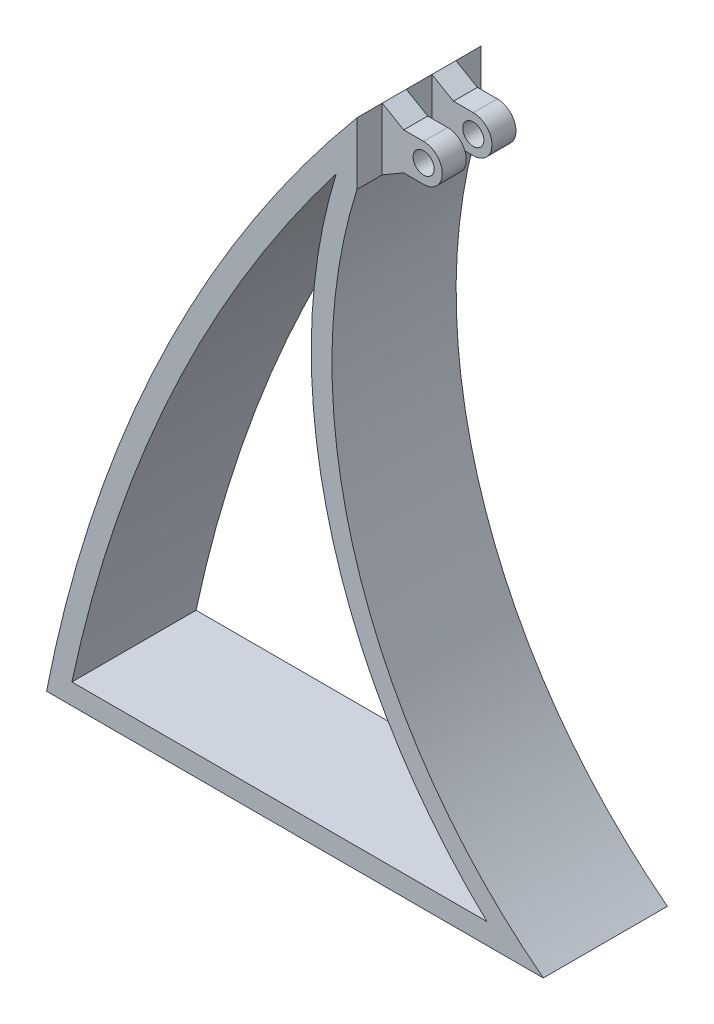
ISO-10303-21;
HEADER;
FILE_DESCRIPTION(('STEP AP214'),'2;1');
FILE_NAME('part.step','',(''),(''),'','','');
FILE_SCHEMA(('AUTOMOTIVE_DESIGN { 1 0 10303 214 1 1 1 1 }'));
ENDSEC;
DATA;
#1=APPLICATION_CONTEXT('core data for automotive mechanical design processes');
#2=APPLICATION_PROTOCOL_DEFINITION('international standard','automotive_design',2000,#1);
#3=PRODUCT_CONTEXT('',#1,'mechanical');
#4=PRODUCT('Part','Part','',(#3));
#5=PRODUCT_RELATED_PRODUCT_CATEGORY('part','',(#4));
#6=PRODUCT_DEFINITION_FORMATION('','',#4);
#7=PRODUCT_DEFINITION_CONTEXT('part definition',#1,'design');
#8=PRODUCT_DEFINITION('design','',#6,#7);
#9=PRODUCT_DEFINITION_SHAPE('','',#8);
#10=(LENGTH_UNIT() NAMED_UNIT(*) SI_UNIT(.MILLI.,.METRE.));
#11=(NAMED_UNIT(*) PLANE_ANGLE_UNIT() SI_UNIT($,.RADIAN.));
#12=(NAMED_UNIT(*) SI_UNIT($,.STERADIAN.) SOLID_ANGLE_UNIT());
#13=UNCERTAINTY_MEASURE_WITH_UNIT(LENGTH_MEASURE(1.E-05),#10,'distance_accuracy_value','');
#14=(GEOMETRIC_REPRESENTATION_CONTEXT(3) GLOBAL_UNCERTAINTY_ASSIGNED_CONTEXT((#13)) GLOBAL_UNIT_ASSIGNED_CONTEXT((#10,
#11,#12)) REPRESENTATION_CONTEXT('',''));
#15=CARTESIAN_POINT('',(0.,0.,0.));
#16=DIRECTION('',(0.,0.,1.));
#17=DIRECTION('',(1.,0.,0.));
#18=AXIS2_PLACEMENT_3D('',#15,#16,#17);
#19=CARTESIAN_POINT('',(15.,0.,15.));
#20=DIRECTION('',(1.,0.,0.));
#21=DIRECTION('',(0.,1.,0.));
#22=AXIS2_PLACEMENT_3D('',#19,#20,#21);
#23=PLANE('',#22);
#24=DIRECTION('',(0.,0.,-1.));
#25=VECTOR('',#24,1.);
#26=CARTESIAN_POINT('',(15.,157.5,15.));
#27=LINE('',#26,#25);
#28=CARTESIAN_POINT('',(15.,157.5,-8.9));
#29=VERTEX_POINT('',#28);
#30=CARTESIAN_POINT('',(15.,157.5,-15.));
#31=VERTEX_POINT('',#30);
#32=EDGE_CURVE('E403',#29,#31,#27,.T.);
#33=ORIENTED_EDGE('',*,*,#32,.F.);
#34=DIRECTION('',(0.,-1.,0.));
#35=VECTOR('',#34,1.);
#36=CARTESIAN_POINT('',(15.,157.5,-8.9));
#37=LINE('',#36,#35);
#38=CARTESIAN_POINT('',(15.,142.5,-8.9));
#39=VERTEX_POINT('',#38);
#40=EDGE_CURVE('E58',#29,#39,#37,.T.);
#41=ORIENTED_EDGE('',*,*,#40,.T.);
#42=DIRECTION('',(0.,0.,-1.));
#43=VECTOR('',#42,1.);
#44=CARTESIAN_POINT('',(15.,142.5,15.));
#45=LINE('',#44,#43);
#46=CARTESIAN_POINT('',(15.,142.5,-15.));
#47=VERTEX_POINT('',#46);
#48=EDGE_CURVE('E51',#39,#47,#45,.T.);
#49=ORIENTED_EDGE('',*,*,#48,.T.);
#50=DIRECTION('',(0.,-1.,0.));
#51=VECTOR('',#50,1.);
#52=CARTESIAN_POINT('',(15.,0.,-15.));
#53=LINE('',#52,#51);
#54=EDGE_CURVE('E388',#31,#47,#53,.T.);
#55=ORIENTED_EDGE('',*,*,#54,.F.);
#56=EDGE_LOOP('',(#33,#41,#49,#55));
#57=FACE_BOUND('',#56,.T.);
#58=ADVANCED_FACE('F41',(#57),#23,.T.);
#59=CARTESIAN_POINT('',(15.,142.5,15.));
#60=VERTEX_POINT('',#59);
#61=CARTESIAN_POINT('',(15.,142.5,8.9));
#62=VERTEX_POINT('',#61);
#63=EDGE_CURVE('E11',#60,#62,#45,.T.);
#64=ORIENTED_EDGE('',*,*,#63,.T.);
#65=DIRECTION('',(0.,-1.,0.));
#66=VECTOR('',#65,1.);
#67=CARTESIAN_POINT('',(15.,157.5,8.9));
#68=LINE('',#67,#66);
#69=CARTESIAN_POINT('',(15.,157.5,8.9));
#70=VERTEX_POINT('',#69);
#71=EDGE_CURVE('E269',#70,#62,#68,.T.);
#72=ORIENTED_EDGE('',*,*,#71,.F.);
#73=CARTESIAN_POINT('',(15.,157.5,15.));
#74=VERTEX_POINT('',#73);
#75=EDGE_CURVE('E404',#74,#70,#27,.T.);
#76=ORIENTED_EDGE('',*,*,#75,.F.);
#77=DIRECTION('',(0.,-1.,0.));
#78=VECTOR('',#77,1.);
#79=CARTESIAN_POINT('',(15.,0.,15.));
#80=LINE('',#79,#78);
#81=EDGE_CURVE('E373',#74,#60,#80,.T.);
#82=ORIENTED_EDGE('',*,*,#81,.T.);
#83=EDGE_LOOP('',(#64,#72,#76,#82));
#84=FACE_BOUND('',#83,.T.);
#85=ADVANCED_FACE('F435',(#84),#23,.T.);
#86=CARTESIAN_POINT('',(138.944289130681,103.285038672847,15.));
#87=DIRECTION('',(0.,0.,-1.));
#88=DIRECTION('',(-1.,0.,0.));
#89=AXIS2_PLACEMENT_3D('',#86,#87,#88);
#90=CYLINDRICAL_SURFACE('',#89,130.);
#91=CARTESIAN_POINT('',(138.944289130681,103.285038672847,-15.));
#92=DIRECTION('',(0.,0.,1.));
#93=DIRECTION('',(1.,0.,0.));
#94=AXIS2_PLACEMENT_3D('',#91,#92,#93);
#95=CIRCLE('',#94,130.);
#96=CARTESIAN_POINT('',(60.,0.,-15.));
#97=VERTEX_POINT('',#96);
#98=EDGE_CURVE('E359',#47,#97,#95,.T.);
#99=ORIENTED_EDGE('',*,*,#98,.F.);
#100=ORIENTED_EDGE('',*,*,#48,.F.);
#101=DIRECTION('',(0.,0.,1.));
#102=VECTOR('',#101,1.);
#103=CARTESIAN_POINT('',(15.,142.5,-8.9));
#104=LINE('',#103,#102);
#105=CARTESIAN_POINT('',(15.,142.5,-3.1));
#106=VERTEX_POINT('',#105);
#107=EDGE_CURVE('E247',#39,#106,#104,.T.);
#108=ORIENTED_EDGE('',*,*,#107,.T.);
#109=CARTESIAN_POINT('',(15.,142.5,3.1));
#110=VERTEX_POINT('',#109);
#111=EDGE_CURVE('E50',#110,#106,#45,.T.);
#112=ORIENTED_EDGE('',*,*,#111,.F.);
#113=DIRECTION('',(0.,0.,-1.));
#114=VECTOR('',#113,1.);
#115=CARTESIAN_POINT('',(15.,142.5,8.9));
#116=LINE('',#115,#114);
#117=EDGE_CURVE('E317',#62,#110,#116,.T.);
#118=ORIENTED_EDGE('',*,*,#117,.F.);
#119=ORIENTED_EDGE('',*,*,#63,.F.);
#120=CARTESIAN_POINT('',(138.944289130681,103.285038672847,15.));
#121=DIRECTION('',(0.,0.,1.));
#122=DIRECTION('',(1.,0.,0.));
#123=AXIS2_PLACEMENT_3D('',#120,#121,#122);
#124=CIRCLE('',#123,130.);
#125=CARTESIAN_POINT('',(60.,0.,15.));
#126=VERTEX_POINT('',#125);
#127=EDGE_CURVE('E369',#60,#126,#124,.T.);
#128=ORIENTED_EDGE('',*,*,#127,.T.);
#129=DIRECTION('',(0.,0.,-1.));
#130=VECTOR('',#129,1.);
#131=CARTESIAN_POINT('',(60.,0.,15.));
#132=LINE('',#131,#130);
#133=EDGE_CURVE('E384',#126,#97,#132,.T.);
#134=ORIENTED_EDGE('',*,*,#133,.T.);
#135=EDGE_LOOP('',(#99,#100,#108,#112,#118,#119,#128,#134));
#136=FACE_BOUND('',#135,.T.);
#137=ADVANCED_FACE('F43',(#136),#90,.F.);
#138=DIRECTION('',(0.,-1.,0.));
#139=VECTOR('',#138,1.);
#140=CARTESIAN_POINT('',(15.,157.5,-3.1));
#141=LINE('',#140,#139);
#142=CARTESIAN_POINT('',(15.,157.5,-3.1));
#143=VERTEX_POINT('',#142);
#144=EDGE_CURVE('E203',#143,#106,#141,.T.);
#145=ORIENTED_EDGE('',*,*,#144,.F.);
#146=CARTESIAN_POINT('',(15.,157.5,3.1));
#147=VERTEX_POINT('',#146);
#148=EDGE_CURVE('E407',#147,#143,#27,.T.);
#149=ORIENTED_EDGE('',*,*,#148,.F.);
#150=DIRECTION('',(0.,-1.,0.));
#151=VECTOR('',#150,1.);
#152=CARTESIAN_POINT('',(15.,157.5,3.1));
#153=LINE('',#152,#151);
#154=EDGE_CURVE('E288',#147,#110,#153,.T.);
#155=ORIENTED_EDGE('',*,*,#154,.T.);
#156=ORIENTED_EDGE('',*,*,#111,.T.);
#157=EDGE_LOOP('',(#145,#149,#155,#156));
#158=FACE_BOUND('',#157,.T.);
#159=ADVANCED_FACE('F453',(#158),#23,.T.);
#160=CARTESIAN_POINT('',(283.531345233212,-66.9792120158153,15.));
#161=DIRECTION('',(0.,0.,-1.));
#162=DIRECTION('',(-1.,0.,0.));
#163=AXIS2_PLACEMENT_3D('',#160,#161,#162);
#164=CYLINDRICAL_SURFACE('',#163,350.);
#165=CARTESIAN_POINT('',(283.531345233212,-66.9792120158153,-15.));
#166=DIRECTION('',(0.,0.,1.));
#167=DIRECTION('',(1.,0.,0.));
#168=AXIS2_PLACEMENT_3D('',#165,#166,#167);
#169=CIRCLE('',#168,350.);
#170=CARTESIAN_POINT('',(-60.,0.,-15.));
#171=VERTEX_POINT('',#170);
#172=EDGE_CURVE('E392',#31,#171,#169,.T.);
#173=ORIENTED_EDGE('',*,*,#172,.T.);
#174=DIRECTION('',(0.,0.,-1.));
#175=VECTOR('',#174,1.);
#176=CARTESIAN_POINT('',(-60.,0.,15.));
#177=LINE('',#176,#175);
#178=CARTESIAN_POINT('',(-60.,0.,15.));
#179=VERTEX_POINT('',#178);
#180=EDGE_CURVE('E400',#179,#171,#177,.T.);
#181=ORIENTED_EDGE('',*,*,#180,.F.);
#182=CARTESIAN_POINT('',(283.531345233212,-66.9792120158153,15.));
#183=DIRECTION('',(0.,0.,1.));
#184=DIRECTION('',(1.,0.,0.));
#185=AXIS2_PLACEMENT_3D('',#182,#183,#184);
#186=CIRCLE('',#185,350.);
#187=EDGE_CURVE('E378',#74,#179,#186,.T.);
#188=ORIENTED_EDGE('',*,*,#187,.F.);
#189=ORIENTED_EDGE('',*,*,#75,.T.);
#190=DIRECTION('',(0.,0.,-1.));
#191=VECTOR('',#190,1.);
#192=CARTESIAN_POINT('',(15.,157.5,8.9));
#193=LINE('',#192,#191);
#194=EDGE_CURVE('E320',#70,#147,#193,.T.);
#195=ORIENTED_EDGE('',*,*,#194,.T.);
#196=ORIENTED_EDGE('',*,*,#148,.T.);
#197=DIRECTION('',(0.,0.,1.));
#198=VECTOR('',#197,1.);
#199=CARTESIAN_POINT('',(15.,157.5,-8.9));
#200=LINE('',#199,#198);
#201=EDGE_CURVE('E223',#29,#143,#200,.T.);
#202=ORIENTED_EDGE('',*,*,#201,.F.);
#203=ORIENTED_EDGE('',*,*,#32,.T.);
#204=EDGE_LOOP('',(#173,#181,#188,#189,#195,#196,#202,#203));
#205=FACE_BOUND('',#204,.T.);
#206=ADVANCED_FACE('F416',(#205),#164,.T.);
#207=CARTESIAN_POINT('',(0.,0.,15.));
#208=DIRECTION('',(0.,1.,0.));
#209=DIRECTION('',(0.,0.,1.));
#210=AXIS2_PLACEMENT_3D('',#207,#208,#209);
#211=PLANE('',#210);
#212=DIRECTION('',(1.,0.,0.));
#213=VECTOR('',#212,1.);
#214=CARTESIAN_POINT('',(0.,0.,-15.));
#215=LINE('',#214,#213);
#216=EDGE_CURVE('E374',#171,#97,#215,.T.);
#217=ORIENTED_EDGE('',*,*,#216,.T.);
#218=ORIENTED_EDGE('',*,*,#133,.F.);
#219=DIRECTION('',(1.,0.,0.));
#220=VECTOR('',#219,1.);
#221=CARTESIAN_POINT('',(0.,0.,15.));
#222=LINE('',#221,#220);
#223=EDGE_CURVE('E381',#179,#126,#222,.T.);
#224=ORIENTED_EDGE('',*,*,#223,.F.);
#225=ORIENTED_EDGE('',*,*,#180,.T.);
#226=EDGE_LOOP('',(#217,#218,#224,#225));
#227=FACE_BOUND('',#226,.T.);
#228=ADVANCED_FACE('F430',(#227),#211,.F.);
#229=CARTESIAN_POINT('',(0.,0.,15.));
#230=DIRECTION('',(0.,0.,1.));
#231=DIRECTION('',(1.,0.,0.));
#232=AXIS2_PLACEMENT_3D('',#229,#230,#231);
#233=PLANE('',#232);
#234=CARTESIAN_POINT('',(138.944289130681,103.285038672847,15.));
#235=DIRECTION('',(0.,0.,-1.));
#236=DIRECTION('',(1.,0.,0.));
#237=AXIS2_PLACEMENT_3D('',#234,#235,#236);
#238=CIRCLE('',#237,135.);
#239=CARTESIAN_POINT('',(46.396727449797,5.,15.));
#240=VERTEX_POINT('',#239);
#241=CARTESIAN_POINT('',(9.99999999999998,143.264662240151,15.));
#242=VERTEX_POINT('',#241);
#243=EDGE_CURVE('E324',#240,#242,#238,.T.);
#244=ORIENTED_EDGE('',*,*,#243,.F.);
#245=DIRECTION('',(1.,0.,0.));
#246=VECTOR('',#245,1.);
#247=CARTESIAN_POINT('',(-53.8764096237002,5.,15.));
#248=LINE('',#247,#246);
#249=CARTESIAN_POINT('',(-53.8764096237002,4.99999999999995,15.));
#250=VERTEX_POINT('',#249);
#251=EDGE_CURVE('E330',#250,#240,#248,.T.);
#252=ORIENTED_EDGE('',*,*,#251,.F.);
#253=CARTESIAN_POINT('',(283.531345233212,-66.9792120158153,15.));
#254=DIRECTION('',(0.,0.,1.));
#255=DIRECTION('',(1.,0.,0.));
#256=AXIS2_PLACEMENT_3D('',#253,#254,#255);
#257=CIRCLE('',#256,345.);
#258=CARTESIAN_POINT('',(9.99999999999998,143.272073770763,15.));
#259=VERTEX_POINT('',#258);
#260=EDGE_CURVE('E349',#259,#250,#257,.T.);
#261=ORIENTED_EDGE('',*,*,#260,.F.);
#262=DIRECTION('',(0.,1.,0.));
#263=VECTOR('',#262,1.);
#264=CARTESIAN_POINT('',(9.99999999999998,143.264662240151,15.));
#265=LINE('',#264,#263);
#266=EDGE_CURVE('E345',#242,#259,#265,.T.);
#267=ORIENTED_EDGE('',*,*,#266,.F.);
#268=EDGE_LOOP('',(#244,#252,#261,#267));
#269=FACE_BOUND('',#268,.T.);
#270=ORIENTED_EDGE('',*,*,#127,.F.);
#271=ORIENTED_EDGE('',*,*,#81,.F.);
#272=ORIENTED_EDGE('',*,*,#187,.T.);
#273=ORIENTED_EDGE('',*,*,#223,.T.);
#274=EDGE_LOOP('',(#270,#271,#272,#273));
#275=FACE_BOUND('',#274,.T.);
#276=ADVANCED_FACE('F433',(#269,#275),#233,.T.);
#277=CARTESIAN_POINT('',(0.,0.,-15.));
#278=DIRECTION('',(0.,0.,1.));
#279=DIRECTION('',(1.,0.,0.));
#280=AXIS2_PLACEMENT_3D('',#277,#278,#279);
#281=PLANE('',#280);
#282=DIRECTION('',(1.,0.,0.));
#283=VECTOR('',#282,1.);
#284=CARTESIAN_POINT('',(-53.8764096237002,5.,-15.));
#285=LINE('',#284,#283);
#286=CARTESIAN_POINT('',(-53.8764096237002,4.99999999999995,-15.));
#287=VERTEX_POINT('',#286);
#288=CARTESIAN_POINT('',(46.396727449797,5.,-15.));
#289=VERTEX_POINT('',#288);
#290=EDGE_CURVE('E338',#287,#289,#285,.T.);
#291=ORIENTED_EDGE('',*,*,#290,.T.);
#292=CARTESIAN_POINT('',(138.944289130681,103.285038672847,-15.));
#293=DIRECTION('',(0.,0.,-1.));
#294=DIRECTION('',(1.,0.,0.));
#295=AXIS2_PLACEMENT_3D('',#292,#293,#294);
#296=CIRCLE('',#295,135.);
#297=CARTESIAN_POINT('',(9.99999999999998,143.264662240151,-15.));
#298=VERTEX_POINT('',#297);
#299=EDGE_CURVE('E325',#289,#298,#296,.T.);
#300=ORIENTED_EDGE('',*,*,#299,.T.);
#301=DIRECTION('',(0.,1.,0.));
#302=VECTOR('',#301,1.);
#303=CARTESIAN_POINT('',(9.99999999999998,143.264662240151,-15.));
#304=LINE('',#303,#302);
#305=CARTESIAN_POINT('',(9.99999999999998,143.272073770763,-15.));
#306=VERTEX_POINT('',#305);
#307=EDGE_CURVE('E329',#298,#306,#304,.T.);
#308=ORIENTED_EDGE('',*,*,#307,.T.);
#309=CARTESIAN_POINT('',(283.531345233212,-66.9792120158153,-15.));
#310=DIRECTION('',(0.,0.,1.));
#311=DIRECTION('',(1.,0.,0.));
#312=AXIS2_PLACEMENT_3D('',#309,#310,#311);
#313=CIRCLE('',#312,345.);
#314=EDGE_CURVE('E334',#306,#287,#313,.T.);
#315=ORIENTED_EDGE('',*,*,#314,.T.);
#316=EDGE_LOOP('',(#291,#300,#308,#315));
#317=FACE_BOUND('',#316,.T.);
#318=ORIENTED_EDGE('',*,*,#98,.T.);
#319=ORIENTED_EDGE('',*,*,#216,.F.);
#320=ORIENTED_EDGE('',*,*,#172,.F.);
#321=ORIENTED_EDGE('',*,*,#54,.T.);
#322=EDGE_LOOP('',(#318,#319,#320,#321));
#323=FACE_BOUND('',#322,.T.);
#324=ADVANCED_FACE('F422',(#317,#323),#281,.F.);
#325=CARTESIAN_POINT('',(138.944289130681,103.285038672847,-15.));
#326=DIRECTION('',(0.,0.,1.));
#327=DIRECTION('',(1.,0.,0.));
#328=AXIS2_PLACEMENT_3D('',#325,#326,#327);
#329=CYLINDRICAL_SURFACE('',#328,135.);
#330=ORIENTED_EDGE('',*,*,#243,.T.);
#331=DIRECTION('',(0.,0.,1.));
#332=VECTOR('',#331,1.);
#333=CARTESIAN_POINT('',(9.99999999999998,143.264662240151,-15.));
#334=LINE('',#333,#332);
#335=EDGE_CURVE('E342',#298,#242,#334,.T.);
#336=ORIENTED_EDGE('',*,*,#335,.F.);
#337=ORIENTED_EDGE('',*,*,#299,.F.);
#338=DIRECTION('',(0.,0.,1.));
#339=VECTOR('',#338,1.);
#340=CARTESIAN_POINT('',(46.396727449797,5.,-15.));
#341=LINE('',#340,#339);
#342=EDGE_CURVE('E356',#289,#240,#341,.T.);
#343=ORIENTED_EDGE('',*,*,#342,.T.);
#344=EDGE_LOOP('',(#330,#336,#337,#343));
#345=FACE_BOUND('',#344,.T.);
#346=ADVANCED_FACE('F687',(#345),#329,.T.);
#347=CARTESIAN_POINT('',(-53.8764096237002,5.,-15.));
#348=DIRECTION('',(0.,-1.,0.));
#349=DIRECTION('',(0.,0.,-1.));
#350=AXIS2_PLACEMENT_3D('',#347,#348,#349);
#351=PLANE('',#350);
#352=ORIENTED_EDGE('',*,*,#251,.T.);
#353=ORIENTED_EDGE('',*,*,#342,.F.);
#354=ORIENTED_EDGE('',*,*,#290,.F.);
#355=DIRECTION('',(0.,0.,1.));
#356=VECTOR('',#355,1.);
#357=CARTESIAN_POINT('',(-53.8764096237002,4.99999999999995,-15.));
#358=LINE('',#357,#356);
#359=EDGE_CURVE('E360',#287,#250,#358,.T.);
#360=ORIENTED_EDGE('',*,*,#359,.T.);
#361=EDGE_LOOP('',(#352,#353,#354,#360));
#362=FACE_BOUND('',#361,.T.);
#363=ADVANCED_FACE('F695',(#362),#351,.F.);
#364=CARTESIAN_POINT('',(283.531345233212,-66.9792120158153,-15.));
#365=DIRECTION('',(0.,0.,1.));
#366=DIRECTION('',(1.,0.,0.));
#367=AXIS2_PLACEMENT_3D('',#364,#365,#366);
#368=CYLINDRICAL_SURFACE('',#367,345.);
#369=ORIENTED_EDGE('',*,*,#260,.T.);
#370=ORIENTED_EDGE('',*,*,#359,.F.);
#371=ORIENTED_EDGE('',*,*,#314,.F.);
#372=DIRECTION('',(0.,0.,1.));
#373=VECTOR('',#372,1.);
#374=CARTESIAN_POINT('',(9.99999999999998,143.272073770763,-15.));
#375=LINE('',#374,#373);
#376=EDGE_CURVE('E363',#306,#259,#375,.T.);
#377=ORIENTED_EDGE('',*,*,#376,.T.);
#378=EDGE_LOOP('',(#369,#370,#371,#377));
#379=FACE_BOUND('',#378,.T.);
#380=ADVANCED_FACE('F703',(#379),#368,.F.);
#381=CARTESIAN_POINT('',(9.99999999999998,143.264662240151,-15.));
#382=DIRECTION('',(1.,0.,0.));
#383=DIRECTION('',(0.,0.,-1.));
#384=AXIS2_PLACEMENT_3D('',#381,#382,#383);
#385=PLANE('',#384);
#386=ORIENTED_EDGE('',*,*,#266,.T.);
#387=ORIENTED_EDGE('',*,*,#376,.F.);
#388=ORIENTED_EDGE('',*,*,#307,.F.);
#389=ORIENTED_EDGE('',*,*,#335,.T.);
#390=EDGE_LOOP('',(#386,#387,#388,#389));
#391=FACE_BOUND('',#390,.T.);
#392=ADVANCED_FACE('F506',(#391),#385,.F.);
#393=CARTESIAN_POINT('',(25.,150.,8.9));
#394=DIRECTION('',(0.,0.,-1.));
#395=DIRECTION('',(-1.,0.,0.));
#396=AXIS2_PLACEMENT_3D('',#393,#394,#395);
#397=PLANE('',#396);
#398=DIRECTION('',(-0.866025403784436,0.500000000000005,0.));
#399=VECTOR('',#398,1.);
#400=CARTESIAN_POINT('',(20.1961524227065,154.5,8.9));
#401=LINE('',#400,#399);
#402=CARTESIAN_POINT('',(20.1961524227065,154.5,8.9));
#403=VERTEX_POINT('',#402);
#404=EDGE_CURVE('E266',#403,#70,#401,.T.);
#405=ORIENTED_EDGE('',*,*,#404,.T.);
#406=ORIENTED_EDGE('',*,*,#71,.T.);
#407=DIRECTION('',(0.866025403784436,0.500000000000005,0.));
#408=VECTOR('',#407,1.);
#409=CARTESIAN_POINT('',(20.1961524227065,145.5,8.9));
#410=LINE('',#409,#408);
#411=CARTESIAN_POINT('',(20.1961524227065,145.5,8.9));
#412=VERTEX_POINT('',#411);
#413=EDGE_CURVE('E273',#62,#412,#410,.T.);
#414=ORIENTED_EDGE('',*,*,#413,.T.);
#415=DIRECTION('',(1.,0.,0.));
#416=VECTOR('',#415,1.);
#417=CARTESIAN_POINT('',(25.,145.5,8.9));
#418=LINE('',#417,#416);
#419=CARTESIAN_POINT('',(25.,145.5,8.9));
#420=VERTEX_POINT('',#419);
#421=EDGE_CURVE('E276',#412,#420,#418,.T.);
#422=ORIENTED_EDGE('',*,*,#421,.T.);
#423=CARTESIAN_POINT('',(25.,150.,8.9));
#424=DIRECTION('',(0.,0.,1.));
#425=DIRECTION('',(-1.,0.,0.));
#426=AXIS2_PLACEMENT_3D('',#423,#424,#425);
#427=CIRCLE('',#426,4.5);
#428=CARTESIAN_POINT('',(25.,154.5,8.9));
#429=VERTEX_POINT('',#428);
#430=EDGE_CURVE('E279',#420,#429,#427,.T.);
#431=ORIENTED_EDGE('',*,*,#430,.T.);
#432=DIRECTION('',(-1.,0.,0.));
#433=VECTOR('',#432,1.);
#434=CARTESIAN_POINT('',(25.,154.5,8.9));
#435=LINE('',#434,#433);
#436=EDGE_CURVE('E282',#429,#403,#435,.T.);
#437=ORIENTED_EDGE('',*,*,#436,.T.);
#438=EDGE_LOOP('',(#405,#406,#414,#422,#431,#437));
#439=FACE_BOUND('',#438,.T.);
#440=CARTESIAN_POINT('',(25.,150.,8.9));
#441=DIRECTION('',(0.,0.,1.));
#442=DIRECTION('',(1.,0.,0.));
#443=AXIS2_PLACEMENT_3D('',#440,#441,#442);
#444=CIRCLE('',#443,2.54999999999999);
#445=CARTESIAN_POINT('',(27.55,150.,8.9));
#446=VERTEX_POINT('',#445);
#447=EDGE_CURVE('E259',#446,#446,#444,.T.);
#448=ORIENTED_EDGE('',*,*,#447,.F.);
#449=EDGE_LOOP('',(#448));
#450=FACE_BOUND('',#449,.T.);
#451=ADVANCED_FACE('F439',(#439,#450),#397,.F.);
#452=CARTESIAN_POINT('',(25.,150.,3.1));
#453=DIRECTION('',(0.,0.,-1.));
#454=DIRECTION('',(-1.,0.,0.));
#455=AXIS2_PLACEMENT_3D('',#452,#453,#454);
#456=PLANE('',#455);
#457=DIRECTION('',(-0.866025403784436,0.500000000000005,0.));
#458=VECTOR('',#457,1.);
#459=CARTESIAN_POINT('',(20.1961524227065,154.5,3.1));
#460=LINE('',#459,#458);
#461=CARTESIAN_POINT('',(20.1961524227065,154.5,3.1));
#462=VERTEX_POINT('',#461);
#463=EDGE_CURVE('E66',#462,#147,#460,.T.);
#464=ORIENTED_EDGE('',*,*,#463,.F.);
#465=DIRECTION('',(-1.,0.,0.));
#466=VECTOR('',#465,1.);
#467=CARTESIAN_POINT('',(25.,154.5,3.1));
#468=LINE('',#467,#466);
#469=CARTESIAN_POINT('',(25.,154.5,3.1));
#470=VERTEX_POINT('',#469);
#471=EDGE_CURVE('E270',#470,#462,#468,.T.);
#472=ORIENTED_EDGE('',*,*,#471,.F.);
#473=CARTESIAN_POINT('',(25.,150.,3.1));
#474=DIRECTION('',(0.,0.,1.));
#475=DIRECTION('',(-1.,0.,0.));
#476=AXIS2_PLACEMENT_3D('',#473,#474,#475);
#477=CIRCLE('',#476,4.5);
#478=CARTESIAN_POINT('',(25.,145.5,3.1));
#479=VERTEX_POINT('',#478);
#480=EDGE_CURVE('E298',#479,#470,#477,.T.);
#481=ORIENTED_EDGE('',*,*,#480,.F.);
#482=DIRECTION('',(1.,0.,0.));
#483=VECTOR('',#482,1.);
#484=CARTESIAN_POINT('',(25.,145.5,3.1));
#485=LINE('',#484,#483);
#486=CARTESIAN_POINT('',(20.1961524227065,145.5,3.1));
#487=VERTEX_POINT('',#486);
#488=EDGE_CURVE('E295',#487,#479,#485,.T.);
#489=ORIENTED_EDGE('',*,*,#488,.F.);
#490=DIRECTION('',(0.866025403784436,0.500000000000005,0.));
#491=VECTOR('',#490,1.);
#492=CARTESIAN_POINT('',(20.1961524227065,145.5,3.1));
#493=LINE('',#492,#491);
#494=EDGE_CURVE('E292',#110,#487,#493,.T.);
#495=ORIENTED_EDGE('',*,*,#494,.F.);
#496=ORIENTED_EDGE('',*,*,#154,.F.);
#497=EDGE_LOOP('',(#464,#472,#481,#489,#495,#496));
#498=FACE_BOUND('',#497,.T.);
#499=CARTESIAN_POINT('',(25.,150.,3.1));
#500=DIRECTION('',(0.,0.,1.));
#501=DIRECTION('',(1.,0.,0.));
#502=AXIS2_PLACEMENT_3D('',#499,#500,#501);
#503=CIRCLE('',#502,2.54999999999999);
#504=CARTESIAN_POINT('',(27.55,150.,3.1));
#505=VERTEX_POINT('',#504);
#506=EDGE_CURVE('E194',#505,#505,#503,.T.);
#507=ORIENTED_EDGE('',*,*,#506,.T.);
#508=EDGE_LOOP('',(#507));
#509=FACE_BOUND('',#508,.T.);
#510=ADVANCED_FACE('F456',(#498,#509),#456,.T.);
#511=CARTESIAN_POINT('',(20.1961524227065,154.5,8.9));
#512=DIRECTION('',(-0.500000000000004,-0.866025403784436,0.));
#513=DIRECTION('',(0.866025403784436,-0.500000000000005,0.));
#514=AXIS2_PLACEMENT_3D('',#511,#512,#513);
#515=PLANE('',#514);
#516=ORIENTED_EDGE('',*,*,#463,.T.);
#517=ORIENTED_EDGE('',*,*,#194,.F.);
#518=ORIENTED_EDGE('',*,*,#404,.F.);
#519=DIRECTION('',(0.,0.,-1.));
#520=VECTOR('',#519,1.);
#521=CARTESIAN_POINT('',(20.1961524227065,154.5,8.9));
#522=LINE('',#521,#520);
#523=EDGE_CURVE('E285',#403,#462,#522,.T.);
#524=ORIENTED_EDGE('',*,*,#523,.T.);
#525=EDGE_LOOP('',(#516,#517,#518,#524));
#526=FACE_BOUND('',#525,.T.);
#527=ADVANCED_FACE('F472',(#526),#515,.F.);
#528=CARTESIAN_POINT('',(20.1961524227065,145.5,8.9));
#529=DIRECTION('',(-0.500000000000005,0.866025403784436,0.));
#530=DIRECTION('',(-0.866025403784436,-0.500000000000005,0.));
#531=AXIS2_PLACEMENT_3D('',#528,#529,#530);
#532=PLANE('',#531);
#533=ORIENTED_EDGE('',*,*,#494,.T.);
#534=DIRECTION('',(0.,0.,-1.));
#535=VECTOR('',#534,1.);
#536=CARTESIAN_POINT('',(20.1961524227065,145.5,8.9));
#537=LINE('',#536,#535);
#538=EDGE_CURVE('E313',#412,#487,#537,.T.);
#539=ORIENTED_EDGE('',*,*,#538,.F.);
#540=ORIENTED_EDGE('',*,*,#413,.F.);
#541=ORIENTED_EDGE('',*,*,#117,.T.);
#542=EDGE_LOOP('',(#533,#539,#540,#541));
#543=FACE_BOUND('',#542,.T.);
#544=ADVANCED_FACE('F445',(#543),#532,.F.);
#545=CARTESIAN_POINT('',(25.,145.5,8.9));
#546=DIRECTION('',(0.,1.,0.));
#547=DIRECTION('',(0.,0.,1.));
#548=AXIS2_PLACEMENT_3D('',#545,#546,#547);
#549=PLANE('',#548);
#550=ORIENTED_EDGE('',*,*,#488,.T.);
#551=DIRECTION('',(0.,0.,-1.));
#552=VECTOR('',#551,1.);
#553=CARTESIAN_POINT('',(25.,145.5,8.9));
#554=LINE('',#553,#552);
#555=EDGE_CURVE('E309',#420,#479,#554,.T.);
#556=ORIENTED_EDGE('',*,*,#555,.F.);
#557=ORIENTED_EDGE('',*,*,#421,.F.);
#558=ORIENTED_EDGE('',*,*,#538,.T.);
#559=EDGE_LOOP('',(#550,#556,#557,#558));
#560=FACE_BOUND('',#559,.T.);
#561=ADVANCED_FACE('F462',(#560),#549,.F.);
#562=CARTESIAN_POINT('',(25.,150.,8.9));
#563=DIRECTION('',(0.,0.,-1.));
#564=DIRECTION('',(-1.,0.,0.));
#565=AXIS2_PLACEMENT_3D('',#562,#563,#564);
#566=CYLINDRICAL_SURFACE('',#565,4.5);
#567=ORIENTED_EDGE('',*,*,#480,.T.);
#568=DIRECTION('',(0.,0.,-1.));
#569=VECTOR('',#568,1.);
#570=CARTESIAN_POINT('',(25.,154.5,8.9));
#571=LINE('',#570,#569);
#572=EDGE_CURVE('E305',#429,#470,#571,.T.);
#573=ORIENTED_EDGE('',*,*,#572,.F.);
#574=ORIENTED_EDGE('',*,*,#430,.F.);
#575=ORIENTED_EDGE('',*,*,#555,.T.);
#576=EDGE_LOOP('',(#567,#573,#574,#575));
#577=FACE_BOUND('',#576,.T.);
#578=ADVANCED_FACE('F469',(#577),#566,.T.);
#579=CARTESIAN_POINT('',(25.,154.5,8.9));
#580=DIRECTION('',(0.,-1.,0.));
#581=DIRECTION('',(0.,0.,-1.));
#582=AXIS2_PLACEMENT_3D('',#579,#580,#581);
#583=PLANE('',#582);
#584=ORIENTED_EDGE('',*,*,#471,.T.);
#585=ORIENTED_EDGE('',*,*,#523,.F.);
#586=ORIENTED_EDGE('',*,*,#436,.F.);
#587=ORIENTED_EDGE('',*,*,#572,.T.);
#588=EDGE_LOOP('',(#584,#585,#586,#587));
#589=FACE_BOUND('',#588,.T.);
#590=ADVANCED_FACE('F471',(#589),#583,.F.);
#591=CARTESIAN_POINT('',(25.,150.,8.9));
#592=DIRECTION('',(0.,0.,-1.));
#593=DIRECTION('',(-1.,0.,0.));
#594=AXIS2_PLACEMENT_3D('',#591,#592,#593);
#595=CYLINDRICAL_SURFACE('',#594,2.54999999999999);
#596=ORIENTED_EDGE('',*,*,#447,.T.);
#597=EDGE_LOOP('',(#596));
#598=FACE_BOUND('',#597,.T.);
#599=ORIENTED_EDGE('',*,*,#506,.F.);
#600=EDGE_LOOP('',(#599));
#601=FACE_BOUND('',#600,.T.);
#602=ADVANCED_FACE('F553',(#598,#601),#595,.F.);
#603=CARTESIAN_POINT('',(20.1961524227065,154.5,-8.9));
#604=DIRECTION('',(0.500000000000004,0.866025403784436,0.));
#605=DIRECTION('',(-0.866025403784436,0.500000000000005,0.));
#606=AXIS2_PLACEMENT_3D('',#603,#604,#605);
#607=PLANE('',#606);
#608=DIRECTION('',(-0.866025403784436,0.500000000000005,0.));
#609=VECTOR('',#608,1.);
#610=CARTESIAN_POINT('',(20.1961524227065,154.5,-3.1));
#611=LINE('',#610,#609);
#612=CARTESIAN_POINT('',(20.1961524227065,154.5,-3.1));
#613=VERTEX_POINT('',#612);
#614=EDGE_CURVE('E188',#613,#143,#611,.T.);
#615=ORIENTED_EDGE('',*,*,#614,.F.);
#616=DIRECTION('',(0.,0.,1.));
#617=VECTOR('',#616,1.);
#618=CARTESIAN_POINT('',(20.1961524227065,154.5,-8.9));
#619=LINE('',#618,#617);
#620=CARTESIAN_POINT('',(20.1961524227065,154.5,-8.9));
#621=VERTEX_POINT('',#620);
#622=EDGE_CURVE('E183',#621,#613,#619,.T.);
#623=ORIENTED_EDGE('',*,*,#622,.F.);
#624=DIRECTION('',(-0.866025403784436,0.500000000000005,0.));
#625=VECTOR('',#624,1.);
#626=CARTESIAN_POINT('',(20.1961524227065,154.5,-8.9));
#627=LINE('',#626,#625);
#628=EDGE_CURVE('E185',#621,#29,#627,.T.);
#629=ORIENTED_EDGE('',*,*,#628,.T.);
#630=ORIENTED_EDGE('',*,*,#201,.T.);
#631=EDGE_LOOP('',(#615,#623,#629,#630));
#632=FACE_BOUND('',#631,.T.);
#633=ADVANCED_FACE('F184',(#632),#607,.T.);
#634=CARTESIAN_POINT('',(25.,154.5,-8.9));
#635=DIRECTION('',(0.,1.,0.));
#636=DIRECTION('',(0.,0.,1.));
#637=AXIS2_PLACEMENT_3D('',#634,#635,#636);
#638=PLANE('',#637);
#639=DIRECTION('',(-1.,0.,0.));
#640=VECTOR('',#639,1.);
#641=CARTESIAN_POINT('',(25.,154.5,-3.1));
#642=LINE('',#641,#640);
#643=CARTESIAN_POINT('',(25.,154.5,-3.1));
#644=VERTEX_POINT('',#643);
#645=EDGE_CURVE('E226',#644,#613,#642,.T.);
#646=ORIENTED_EDGE('',*,*,#645,.F.);
#647=DIRECTION('',(0.,0.,1.));
#648=VECTOR('',#647,1.);
#649=CARTESIAN_POINT('',(25.,154.5,-8.9));
#650=LINE('',#649,#648);
#651=CARTESIAN_POINT('',(25.,154.5,-8.9));
#652=VERTEX_POINT('',#651);
#653=EDGE_CURVE('E195',#652,#644,#650,.T.);
#654=ORIENTED_EDGE('',*,*,#653,.F.);
#655=DIRECTION('',(-1.,0.,0.));
#656=VECTOR('',#655,1.);
#657=CARTESIAN_POINT('',(25.,154.5,-8.9));
#658=LINE('',#657,#656);
#659=EDGE_CURVE('E200',#652,#621,#658,.T.);
#660=ORIENTED_EDGE('',*,*,#659,.T.);
#661=ORIENTED_EDGE('',*,*,#622,.T.);
#662=EDGE_LOOP('',(#646,#654,#660,#661));
#663=FACE_BOUND('',#662,.T.);
#664=ADVANCED_FACE('F205',(#663),#638,.T.);
#665=CARTESIAN_POINT('',(25.,150.,-8.9));
#666=DIRECTION('',(0.,0.,1.));
#667=DIRECTION('',(1.,0.,0.));
#668=AXIS2_PLACEMENT_3D('',#665,#666,#667);
#669=CYLINDRICAL_SURFACE('',#668,4.5);
#670=CARTESIAN_POINT('',(25.,150.,-3.1));
#671=DIRECTION('',(0.,0.,1.));
#672=DIRECTION('',(-1.,0.,0.));
#673=AXIS2_PLACEMENT_3D('',#670,#671,#672);
#674=CIRCLE('',#673,4.5);
#675=CARTESIAN_POINT('',(25.,145.5,-3.1));
#676=VERTEX_POINT('',#675);
#677=EDGE_CURVE('E230',#676,#644,#674,.T.);
#678=ORIENTED_EDGE('',*,*,#677,.F.);
#679=DIRECTION('',(0.,0.,1.));
#680=VECTOR('',#679,1.);
#681=CARTESIAN_POINT('',(25.,145.5,-8.9));
#682=LINE('',#681,#680);
#683=CARTESIAN_POINT('',(25.,145.5,-8.9));
#684=VERTEX_POINT('',#683);
#685=EDGE_CURVE('E254',#684,#676,#682,.T.);
#686=ORIENTED_EDGE('',*,*,#685,.F.);
#687=CARTESIAN_POINT('',(25.,150.,-8.9));
#688=DIRECTION('',(0.,0.,1.));
#689=DIRECTION('',(-1.,0.,0.));
#690=AXIS2_PLACEMENT_3D('',#687,#688,#689);
#691=CIRCLE('',#690,4.5);
#692=EDGE_CURVE('E207',#684,#652,#691,.T.);
#693=ORIENTED_EDGE('',*,*,#692,.T.);
#694=ORIENTED_EDGE('',*,*,#653,.T.);
#695=EDGE_LOOP('',(#678,#686,#693,#694));
#696=FACE_BOUND('',#695,.T.);
#697=ADVANCED_FACE('F584',(#696),#669,.T.);
#698=CARTESIAN_POINT('',(25.,145.5,-8.9));
#699=DIRECTION('',(0.,-1.,0.));
#700=DIRECTION('',(0.,0.,-1.));
#701=AXIS2_PLACEMENT_3D('',#698,#699,#700);
#702=PLANE('',#701);
#703=DIRECTION('',(1.,0.,0.));
#704=VECTOR('',#703,1.);
#705=CARTESIAN_POINT('',(25.,145.5,-3.1));
#706=LINE('',#705,#704);
#707=CARTESIAN_POINT('',(20.1961524227065,145.5,-3.1));
#708=VERTEX_POINT('',#707);
#709=EDGE_CURVE('E234',#708,#676,#706,.T.);
#710=ORIENTED_EDGE('',*,*,#709,.F.);
#711=DIRECTION('',(0.,0.,1.));
#712=VECTOR('',#711,1.);
#713=CARTESIAN_POINT('',(20.1961524227065,145.5,-8.9));
#714=LINE('',#713,#712);
#715=CARTESIAN_POINT('',(20.1961524227065,145.5,-8.9));
#716=VERTEX_POINT('',#715);
#717=EDGE_CURVE('E251',#716,#708,#714,.T.);
#718=ORIENTED_EDGE('',*,*,#717,.F.);
#719=DIRECTION('',(1.,0.,0.));
#720=VECTOR('',#719,1.);
#721=CARTESIAN_POINT('',(25.,145.5,-8.9));
#722=LINE('',#721,#720);
#723=EDGE_CURVE('E210',#716,#684,#722,.T.);
#724=ORIENTED_EDGE('',*,*,#723,.T.);
#725=ORIENTED_EDGE('',*,*,#685,.T.);
#726=EDGE_LOOP('',(#710,#718,#724,#725));
#727=FACE_BOUND('',#726,.T.);
#728=ADVANCED_FACE('F592',(#727),#702,.T.);
#729=CARTESIAN_POINT('',(20.1961524227065,145.5,-8.9));
#730=DIRECTION('',(0.500000000000005,-0.866025403784436,0.));
#731=DIRECTION('',(0.866025403784436,0.500000000000005,0.));
#732=AXIS2_PLACEMENT_3D('',#729,#730,#731);
#733=PLANE('',#732);
#734=DIRECTION('',(0.866025403784436,0.500000000000005,0.));
#735=VECTOR('',#734,1.);
#736=CARTESIAN_POINT('',(20.1961524227065,145.5,-3.1));
#737=LINE('',#736,#735);
#738=EDGE_CURVE('E238',#106,#708,#737,.T.);
#739=ORIENTED_EDGE('',*,*,#738,.F.);
#740=ORIENTED_EDGE('',*,*,#107,.F.);
#741=DIRECTION('',(0.866025403784436,0.500000000000005,0.));
#742=VECTOR('',#741,1.);
#743=CARTESIAN_POINT('',(20.1961524227065,145.5,-8.9));
#744=LINE('',#743,#742);
#745=EDGE_CURVE('E217',#39,#716,#744,.T.);
#746=ORIENTED_EDGE('',*,*,#745,.T.);
#747=ORIENTED_EDGE('',*,*,#717,.T.);
#748=EDGE_LOOP('',(#739,#740,#746,#747));
#749=FACE_BOUND('',#748,.T.);
#750=ADVANCED_FACE('F601',(#749),#733,.T.);
#751=CARTESIAN_POINT('',(25.,150.,-8.9));
#752=DIRECTION('',(0.,0.,1.));
#753=DIRECTION('',(-1.,0.,0.));
#754=AXIS2_PLACEMENT_3D('',#751,#752,#753);
#755=PLANE('',#754);
#756=CARTESIAN_POINT('',(25.,150.,-8.9));
#757=DIRECTION('',(0.,0.,1.));
#758=DIRECTION('',(1.,0.,0.));
#759=AXIS2_PLACEMENT_3D('',#756,#757,#758);
#760=CIRCLE('',#759,2.54999999999999);
#761=CARTESIAN_POINT('',(27.55,150.,-8.9));
#762=VERTEX_POINT('',#761);
#763=EDGE_CURVE('E227',#762,#762,#760,.T.);
#764=ORIENTED_EDGE('',*,*,#763,.T.);
#765=EDGE_LOOP('',(#764));
#766=FACE_BOUND('',#765,.T.);
#767=ORIENTED_EDGE('',*,*,#628,.F.);
#768=ORIENTED_EDGE('',*,*,#659,.F.);
#769=ORIENTED_EDGE('',*,*,#692,.F.);
#770=ORIENTED_EDGE('',*,*,#723,.F.);
#771=ORIENTED_EDGE('',*,*,#745,.F.);
#772=ORIENTED_EDGE('',*,*,#40,.F.);
#773=EDGE_LOOP('',(#767,#768,#769,#770,#771,#772));
#774=FACE_BOUND('',#773,.T.);
#775=ADVANCED_FACE('F198',(#766,#774),#755,.F.);
#776=CARTESIAN_POINT('',(25.,150.,-3.1));
#777=DIRECTION('',(0.,0.,1.));
#778=DIRECTION('',(-1.,0.,0.));
#779=AXIS2_PLACEMENT_3D('',#776,#777,#778);
#780=PLANE('',#779);
#781=CARTESIAN_POINT('',(25.,150.,-3.1));
#782=DIRECTION('',(0.,0.,1.));
#783=DIRECTION('',(1.,0.,0.));
#784=AXIS2_PLACEMENT_3D('',#781,#782,#783);
#785=CIRCLE('',#784,2.54999999999999);
#786=CARTESIAN_POINT('',(27.55,150.,-3.1));
#787=VERTEX_POINT('',#786);
#788=EDGE_CURVE('E651',#787,#787,#785,.T.);
#789=ORIENTED_EDGE('',*,*,#788,.F.);
#790=EDGE_LOOP('',(#789));
#791=FACE_BOUND('',#790,.T.);
#792=ORIENTED_EDGE('',*,*,#614,.T.);
#793=ORIENTED_EDGE('',*,*,#144,.T.);
#794=ORIENTED_EDGE('',*,*,#738,.T.);
#795=ORIENTED_EDGE('',*,*,#709,.T.);
#796=ORIENTED_EDGE('',*,*,#677,.T.);
#797=ORIENTED_EDGE('',*,*,#645,.T.);
#798=EDGE_LOOP('',(#792,#793,#794,#795,#796,#797));
#799=FACE_BOUND('',#798,.T.);
#800=ADVANCED_FACE('F618',(#791,#799),#780,.T.);
#801=CARTESIAN_POINT('',(25.,150.,-8.9));
#802=DIRECTION('',(0.,0.,1.));
#803=DIRECTION('',(1.,0.,0.));
#804=AXIS2_PLACEMENT_3D('',#801,#802,#803);
#805=CYLINDRICAL_SURFACE('',#804,2.54999999999999);
#806=ORIENTED_EDGE('',*,*,#763,.F.);
#807=EDGE_LOOP('',(#806));
#808=FACE_BOUND('',#807,.T.);
#809=ORIENTED_EDGE('',*,*,#788,.T.);
#810=EDGE_LOOP('',(#809));
#811=FACE_BOUND('',#810,.T.);
#812=ADVANCED_FACE('F627',(#808,#811),#805,.F.);
#813=CLOSED_SHELL('',(#58,#85,#137,#159,#206,#228,#276,#324,#346,#363,#380,#392,#451,#510,#527,
#544,#561,#578,#590,#602,#633,#664,#697,#728,#750,#775,#800,#812));
#814=MANIFOLD_SOLID_BREP('B2',#813);
#815=ADVANCED_BREP_SHAPE_REPRESENTATION('',(#18,#814),#14);
#816=SHAPE_DEFINITION_REPRESENTATION(#9,#815);
ENDSEC;
END-ISO-10303-21;
